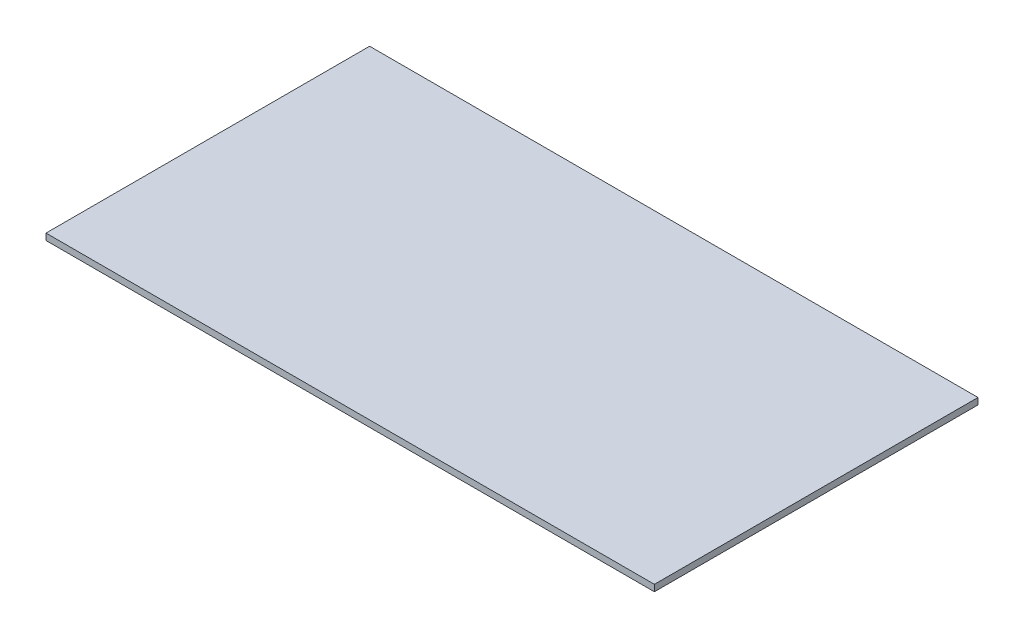
ISO-10303-21;
HEADER;
FILE_DESCRIPTION(('STEP AP214'),'2;1');
FILE_NAME('part.step','',(''),(''),'','','');
FILE_SCHEMA(('AUTOMOTIVE_DESIGN { 1 0 10303 214 1 1 1 1 }'));
ENDSEC;
DATA;
#1=APPLICATION_CONTEXT('core data for automotive mechanical design processes');
#2=APPLICATION_PROTOCOL_DEFINITION('international standard','automotive_design',2000,#1);
#3=PRODUCT_CONTEXT('',#1,'mechanical');
#4=PRODUCT('Part','Part','',(#3));
#5=PRODUCT_RELATED_PRODUCT_CATEGORY('part','',(#4));
#6=PRODUCT_DEFINITION_FORMATION('','',#4);
#7=PRODUCT_DEFINITION_CONTEXT('part definition',#1,'design');
#8=PRODUCT_DEFINITION('design','',#6,#7);
#9=PRODUCT_DEFINITION_SHAPE('','',#8);
#10=(LENGTH_UNIT() NAMED_UNIT(*) SI_UNIT(.MILLI.,.METRE.));
#11=(NAMED_UNIT(*) PLANE_ANGLE_UNIT() SI_UNIT($,.RADIAN.));
#12=(NAMED_UNIT(*) SI_UNIT($,.STERADIAN.) SOLID_ANGLE_UNIT());
#13=UNCERTAINTY_MEASURE_WITH_UNIT(LENGTH_MEASURE(1.E-05),#10,'distance_accuracy_value','');
#14=(GEOMETRIC_REPRESENTATION_CONTEXT(3) GLOBAL_UNCERTAINTY_ASSIGNED_CONTEXT((#13)) GLOBAL_UNIT_ASSIGNED_CONTEXT((#10,
#11,#12)) REPRESENTATION_CONTEXT('',''));
#15=CARTESIAN_POINT('',(0.,0.,0.));
#16=DIRECTION('',(0.,0.,1.));
#17=DIRECTION('',(1.,0.,0.));
#18=AXIS2_PLACEMENT_3D('',#15,#16,#17);
#19=CARTESIAN_POINT('',(0.,50.,0.));
#20=DIRECTION('',(1.,0.,0.));
#21=DIRECTION('',(0.,0.,-1.));
#22=AXIS2_PLACEMENT_3D('',#19,#20,#21);
#23=PLANE('',#22);
#24=DIRECTION('',(0.,0.,1.));
#25=VECTOR('',#24,1.);
#26=CARTESIAN_POINT('',(0.,0.,0.));
#27=LINE('',#26,#25);
#28=CARTESIAN_POINT('',(0.,0.,-2500.));
#29=VERTEX_POINT('',#28);
#30=CARTESIAN_POINT('',(0.,0.,0.));
#31=VERTEX_POINT('',#30);
#32=EDGE_CURVE('E107',#29,#31,#27,.T.);
#33=ORIENTED_EDGE('',*,*,#32,.T.);
#34=DIRECTION('',(0.,-1.,0.));
#35=VECTOR('',#34,1.);
#36=CARTESIAN_POINT('',(0.,50.,0.));
#37=LINE('',#36,#35);
#38=CARTESIAN_POINT('',(0.,50.,0.));
#39=VERTEX_POINT('',#38);
#40=EDGE_CURVE('E11',#39,#31,#37,.T.);
#41=ORIENTED_EDGE('',*,*,#40,.F.);
#42=DIRECTION('',(0.,0.,1.));
#43=VECTOR('',#42,1.);
#44=CARTESIAN_POINT('',(0.,50.,0.));
#45=LINE('',#44,#43);
#46=CARTESIAN_POINT('',(0.,50.,-2500.));
#47=VERTEX_POINT('',#46);
#48=EDGE_CURVE('E91',#47,#39,#45,.T.);
#49=ORIENTED_EDGE('',*,*,#48,.F.);
#50=DIRECTION('',(0.,-1.,0.));
#51=VECTOR('',#50,1.);
#52=CARTESIAN_POINT('',(0.,50.,-2500.));
#53=LINE('',#52,#51);
#54=EDGE_CURVE('E103',#47,#29,#53,.T.);
#55=ORIENTED_EDGE('',*,*,#54,.T.);
#56=EDGE_LOOP('',(#33,#41,#49,#55));
#57=FACE_BOUND('',#56,.T.);
#58=ADVANCED_FACE('F39',(#57),#23,.F.);
#59=CARTESIAN_POINT('',(0.,50.,0.));
#60=DIRECTION('',(0.,0.,-1.));
#61=DIRECTION('',(-1.,0.,0.));
#62=AXIS2_PLACEMENT_3D('',#59,#60,#61);
#63=PLANE('',#62);
#64=DIRECTION('',(1.,0.,0.));
#65=VECTOR('',#64,1.);
#66=CARTESIAN_POINT('',(0.,0.,0.));
#67=LINE('',#66,#65);
#68=CARTESIAN_POINT('',(4700.,0.,0.));
#69=VERTEX_POINT('',#68);
#70=EDGE_CURVE('E96',#31,#69,#67,.T.);
#71=ORIENTED_EDGE('',*,*,#70,.T.);
#72=DIRECTION('',(0.,-1.,0.));
#73=VECTOR('',#72,1.);
#74=CARTESIAN_POINT('',(4700.,50.,0.));
#75=LINE('',#74,#73);
#76=CARTESIAN_POINT('',(4700.,50.,0.));
#77=VERTEX_POINT('',#76);
#78=EDGE_CURVE('E48',#77,#69,#75,.T.);
#79=ORIENTED_EDGE('',*,*,#78,.F.);
#80=DIRECTION('',(1.,0.,0.));
#81=VECTOR('',#80,1.);
#82=CARTESIAN_POINT('',(0.,50.,0.));
#83=LINE('',#82,#81);
#84=EDGE_CURVE('E86',#39,#77,#83,.T.);
#85=ORIENTED_EDGE('',*,*,#84,.F.);
#86=ORIENTED_EDGE('',*,*,#40,.T.);
#87=EDGE_LOOP('',(#71,#79,#85,#86));
#88=FACE_BOUND('',#87,.T.);
#89=ADVANCED_FACE('F95',(#88),#63,.F.);
#90=CARTESIAN_POINT('',(4700.,50.,0.));
#91=DIRECTION('',(-1.,0.,0.));
#92=DIRECTION('',(0.,0.,1.));
#93=AXIS2_PLACEMENT_3D('',#90,#91,#92);
#94=PLANE('',#93);
#95=DIRECTION('',(0.,0.,-1.));
#96=VECTOR('',#95,1.);
#97=CARTESIAN_POINT('',(4700.,0.,0.));
#98=LINE('',#97,#96);
#99=CARTESIAN_POINT('',(4700.,0.,-2500.));
#100=VERTEX_POINT('',#99);
#101=EDGE_CURVE('E73',#69,#100,#98,.T.);
#102=ORIENTED_EDGE('',*,*,#101,.T.);
#103=DIRECTION('',(0.,-1.,0.));
#104=VECTOR('',#103,1.);
#105=CARTESIAN_POINT('',(4700.,50.,-2500.));
#106=LINE('',#105,#104);
#107=CARTESIAN_POINT('',(4700.,50.,-2500.));
#108=VERTEX_POINT('',#107);
#109=EDGE_CURVE('E98',#108,#100,#106,.T.);
#110=ORIENTED_EDGE('',*,*,#109,.F.);
#111=DIRECTION('',(0.,0.,-1.));
#112=VECTOR('',#111,1.);
#113=CARTESIAN_POINT('',(4700.,50.,0.));
#114=LINE('',#113,#112);
#115=EDGE_CURVE('E89',#77,#108,#114,.T.);
#116=ORIENTED_EDGE('',*,*,#115,.F.);
#117=ORIENTED_EDGE('',*,*,#78,.T.);
#118=EDGE_LOOP('',(#102,#110,#116,#117));
#119=FACE_BOUND('',#118,.T.);
#120=ADVANCED_FACE('F99',(#119),#94,.F.);
#121=CARTESIAN_POINT('',(0.,50.,-2500.));
#122=DIRECTION('',(0.,0.,1.));
#123=DIRECTION('',(1.,0.,0.));
#124=AXIS2_PLACEMENT_3D('',#121,#122,#123);
#125=PLANE('',#124);
#126=DIRECTION('',(-1.,0.,0.));
#127=VECTOR('',#126,1.);
#128=CARTESIAN_POINT('',(0.,0.,-2500.));
#129=LINE('',#128,#127);
#130=EDGE_CURVE('E79',#100,#29,#129,.T.);
#131=ORIENTED_EDGE('',*,*,#130,.T.);
#132=ORIENTED_EDGE('',*,*,#54,.F.);
#133=DIRECTION('',(-1.,0.,0.));
#134=VECTOR('',#133,1.);
#135=CARTESIAN_POINT('',(0.,50.,-2500.));
#136=LINE('',#135,#134);
#137=EDGE_CURVE('E56',#108,#47,#136,.T.);
#138=ORIENTED_EDGE('',*,*,#137,.F.);
#139=ORIENTED_EDGE('',*,*,#109,.T.);
#140=EDGE_LOOP('',(#131,#132,#138,#139));
#141=FACE_BOUND('',#140,.T.);
#142=ADVANCED_FACE('F120',(#141),#125,.F.);
#143=CARTESIAN_POINT('',(0.,50.,0.));
#144=DIRECTION('',(0.,-1.,0.));
#145=DIRECTION('',(0.,0.,-1.));
#146=AXIS2_PLACEMENT_3D('',#143,#144,#145);
#147=PLANE('',#146);
#148=ORIENTED_EDGE('',*,*,#48,.T.);
#149=ORIENTED_EDGE('',*,*,#84,.T.);
#150=ORIENTED_EDGE('',*,*,#115,.T.);
#151=ORIENTED_EDGE('',*,*,#137,.T.);
#152=EDGE_LOOP('',(#148,#149,#150,#151));
#153=FACE_BOUND('',#152,.T.);
#154=ADVANCED_FACE('F87',(#153),#147,.F.);
#155=CARTESIAN_POINT('',(0.,0.,0.));
#156=DIRECTION('',(0.,-1.,0.));
#157=DIRECTION('',(0.,0.,-1.));
#158=AXIS2_PLACEMENT_3D('',#155,#156,#157);
#159=PLANE('',#158);
#160=ORIENTED_EDGE('',*,*,#32,.F.);
#161=ORIENTED_EDGE('',*,*,#130,.F.);
#162=ORIENTED_EDGE('',*,*,#101,.F.);
#163=ORIENTED_EDGE('',*,*,#70,.F.);
#164=EDGE_LOOP('',(#160,#161,#162,#163));
#165=FACE_BOUND('',#164,.T.);
#166=ADVANCED_FACE('F123',(#165),#159,.T.);
#167=CLOSED_SHELL('',(#58,#89,#120,#142,#154,#166));
#168=MANIFOLD_SOLID_BREP('B2',#167);
#169=ADVANCED_BREP_SHAPE_REPRESENTATION('',(#18,#168),#14);
#170=SHAPE_DEFINITION_REPRESENTATION(#9,#169);
ENDSEC;
END-ISO-10303-21;
